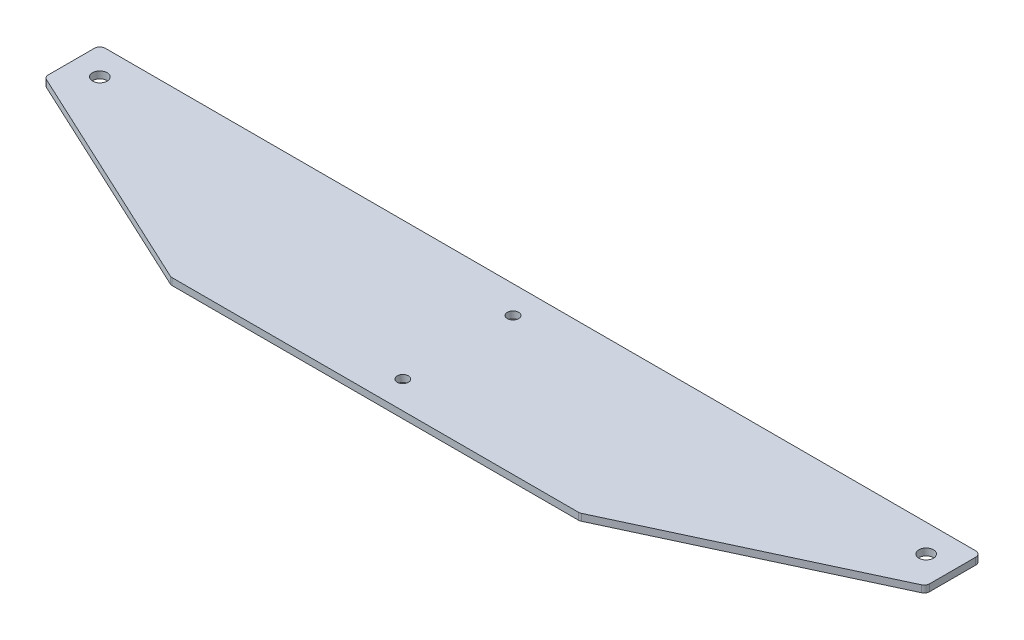
ISO-10303-21;
HEADER;
FILE_DESCRIPTION(('STEP AP214'),'2;1');
FILE_NAME('part.step','',(''),(''),'','','');
FILE_SCHEMA(('AUTOMOTIVE_DESIGN { 1 0 10303 214 1 1 1 1 }'));
ENDSEC;
DATA;
#1=APPLICATION_CONTEXT('core data for automotive mechanical design processes');
#2=APPLICATION_PROTOCOL_DEFINITION('international standard','automotive_design',2000,#1);
#3=PRODUCT_CONTEXT('',#1,'mechanical');
#4=PRODUCT('Part','Part','',(#3));
#5=PRODUCT_RELATED_PRODUCT_CATEGORY('part','',(#4));
#6=PRODUCT_DEFINITION_FORMATION('','',#4);
#7=PRODUCT_DEFINITION_CONTEXT('part definition',#1,'design');
#8=PRODUCT_DEFINITION('design','',#6,#7);
#9=PRODUCT_DEFINITION_SHAPE('','',#8);
#10=(LENGTH_UNIT() NAMED_UNIT(*) SI_UNIT(.MILLI.,.METRE.));
#11=(NAMED_UNIT(*) PLANE_ANGLE_UNIT() SI_UNIT($,.RADIAN.));
#12=(NAMED_UNIT(*) SI_UNIT($,.STERADIAN.) SOLID_ANGLE_UNIT());
#13=UNCERTAINTY_MEASURE_WITH_UNIT(LENGTH_MEASURE(1.E-05),#10,'distance_accuracy_value','');
#14=(GEOMETRIC_REPRESENTATION_CONTEXT(3) GLOBAL_UNCERTAINTY_ASSIGNED_CONTEXT((#13)) GLOBAL_UNIT_ASSIGNED_CONTEXT((#10,
#11,#12)) REPRESENTATION_CONTEXT('',''));
#15=CARTESIAN_POINT('',(0.,0.,0.));
#16=DIRECTION('',(0.,0.,1.));
#17=DIRECTION('',(1.,0.,0.));
#18=AXIS2_PLACEMENT_3D('',#15,#16,#17);
#19=CARTESIAN_POINT('',(0.,3.175,0.));
#20=DIRECTION('',(0.,-1.,0.));
#21=DIRECTION('',(0.,0.,-1.));
#22=AXIS2_PLACEMENT_3D('',#19,#20,#21);
#23=PLANE('',#22);
#24=DIRECTION('',(1.,0.,0.));
#25=VECTOR('',#24,1.);
#26=CARTESIAN_POINT('',(-203.2,3.175,38.1));
#27=LINE('',#26,#25);
#28=CARTESIAN_POINT('',(-93.6959439950015,3.175,38.1));
#29=VERTEX_POINT('',#28);
#30=CARTESIAN_POINT('',(93.6959439950015,3.175,38.1));
#31=VERTEX_POINT('',#30);
#32=EDGE_CURVE('E142',#29,#31,#27,.T.);
#33=ORIENTED_EDGE('',*,*,#32,.T.);
#34=CARTESIAN_POINT('',(93.6959439950015,3.175,35.56));
#35=DIRECTION('',(0.,-1.,0.));
#36=DIRECTION('',(0.,0.,-1.));
#37=AXIS2_PLACEMENT_3D('',#34,#35,#36);
#38=CIRCLE('',#37,2.54);
#39=CARTESIAN_POINT('',(94.7693943798229,3.175,37.8620217790731));
#40=VERTEX_POINT('',#39);
#41=EDGE_CURVE('E181',#31,#40,#38,.F.);
#42=ORIENTED_EDGE('',*,*,#41,.T.);
#43=DIRECTION('',(-0.90630778703665,0.,0.4226182617407));
#44=VECTOR('',#43,1.);
#45=CARTESIAN_POINT('',(203.2,3.175,-12.7));
#46=LINE('',#45,#44);
#47=CARTESIAN_POINT('',(201.733450384821,3.175,-12.016136683378));
#48=VERTEX_POINT('',#47);
#49=EDGE_CURVE('E144',#40,#48,#46,.F.);
#50=ORIENTED_EDGE('',*,*,#49,.T.);
#51=CARTESIAN_POINT('',(200.66,3.175,-14.3181584624511));
#52=DIRECTION('',(0.,-1.,0.));
#53=DIRECTION('',(0.,0.,-1.));
#54=AXIS2_PLACEMENT_3D('',#51,#52,#53);
#55=CIRCLE('',#54,2.54);
#56=CARTESIAN_POINT('',(203.2,3.175,-14.3181584624511));
#57=VERTEX_POINT('',#56);
#58=EDGE_CURVE('E175',#48,#57,#55,.F.);
#59=ORIENTED_EDGE('',*,*,#58,.T.);
#60=DIRECTION('',(0.,0.,-1.));
#61=VECTOR('',#60,1.);
#62=CARTESIAN_POINT('',(203.2,3.175,38.1));
#63=LINE('',#62,#61);
#64=CARTESIAN_POINT('',(203.2,3.175,-35.56));
#65=VERTEX_POINT('',#64);
#66=EDGE_CURVE('E150',#57,#65,#63,.T.);
#67=ORIENTED_EDGE('',*,*,#66,.T.);
#68=CARTESIAN_POINT('',(200.66,3.175,-35.56));
#69=DIRECTION('',(0.,-1.,0.));
#70=DIRECTION('',(0.,0.,-1.));
#71=AXIS2_PLACEMENT_3D('',#68,#69,#70);
#72=CIRCLE('',#71,2.54);
#73=CARTESIAN_POINT('',(200.66,3.175,-38.1));
#74=VERTEX_POINT('',#73);
#75=EDGE_CURVE('E173',#65,#74,#72,.F.);
#76=ORIENTED_EDGE('',*,*,#75,.T.);
#77=DIRECTION('',(-1.,0.,0.));
#78=VECTOR('',#77,1.);
#79=CARTESIAN_POINT('',(-203.2,3.175,-38.1));
#80=LINE('',#79,#78);
#81=CARTESIAN_POINT('',(-200.66,3.175,-38.1));
#82=VERTEX_POINT('',#81);
#83=EDGE_CURVE('E154',#74,#82,#80,.T.);
#84=ORIENTED_EDGE('',*,*,#83,.T.);
#85=CARTESIAN_POINT('',(-200.66,3.175,-35.56));
#86=DIRECTION('',(0.,-1.,0.));
#87=DIRECTION('',(0.,0.,-1.));
#88=AXIS2_PLACEMENT_3D('',#85,#86,#87);
#89=CIRCLE('',#88,2.54);
#90=CARTESIAN_POINT('',(-203.2,3.175,-35.56));
#91=VERTEX_POINT('',#90);
#92=EDGE_CURVE('E171',#82,#91,#89,.F.);
#93=ORIENTED_EDGE('',*,*,#92,.T.);
#94=DIRECTION('',(0.,0.,1.));
#95=VECTOR('',#94,1.);
#96=CARTESIAN_POINT('',(-203.2,3.175,38.1));
#97=LINE('',#96,#95);
#98=CARTESIAN_POINT('',(-203.2,3.175,-14.3181584624511));
#99=VERTEX_POINT('',#98);
#100=EDGE_CURVE('E218',#91,#99,#97,.T.);
#101=ORIENTED_EDGE('',*,*,#100,.T.);
#102=CARTESIAN_POINT('',(-200.66,3.175,-14.3181584624511));
#103=DIRECTION('',(0.,-1.,0.));
#104=DIRECTION('',(0.,0.,-1.));
#105=AXIS2_PLACEMENT_3D('',#102,#103,#104);
#106=CIRCLE('',#105,2.54);
#107=CARTESIAN_POINT('',(-201.733450384821,3.175,-12.016136683378));
#108=VERTEX_POINT('',#107);
#109=EDGE_CURVE('E177',#99,#108,#106,.F.);
#110=ORIENTED_EDGE('',*,*,#109,.T.);
#111=DIRECTION('',(-0.90630778703665,0.,-0.4226182617407));
#112=VECTOR('',#111,1.);
#113=CARTESIAN_POINT('',(-94.2590484381146,3.175,38.1));
#114=LINE('',#113,#112);
#115=CARTESIAN_POINT('',(-94.7693943798229,3.175,37.8620217790731));
#116=VERTEX_POINT('',#115);
#117=EDGE_CURVE('E163',#108,#116,#114,.F.);
#118=ORIENTED_EDGE('',*,*,#117,.T.);
#119=CARTESIAN_POINT('',(-93.6959439950015,3.175,35.56));
#120=DIRECTION('',(0.,-1.,0.));
#121=DIRECTION('',(0.,0.,-1.));
#122=AXIS2_PLACEMENT_3D('',#119,#120,#121);
#123=CIRCLE('',#122,2.54);
#124=EDGE_CURVE('E179',#116,#29,#123,.F.);
#125=ORIENTED_EDGE('',*,*,#124,.T.);
#126=EDGE_LOOP('',(#33,#42,#50,#59,#67,#76,#84,#93,#101,#110,#118,#125));
#127=FACE_BOUND('',#126,.T.);
#128=CARTESIAN_POINT('',(-190.5,3.175,-25.4));
#129=DIRECTION('',(0.,1.,0.));
#130=DIRECTION('',(0.,0.,1.));
#131=AXIS2_PLACEMENT_3D('',#128,#129,#130);
#132=CIRCLE('',#131,3.3734375);
#133=CARTESIAN_POINT('',(-190.5,3.175,-22.0265625));
#134=VERTEX_POINT('',#133);
#135=EDGE_CURVE('E234',#134,#134,#132,.T.);
#136=ORIENTED_EDGE('',*,*,#135,.F.);
#137=EDGE_LOOP('',(#136));
#138=FACE_BOUND('',#137,.T.);
#139=CARTESIAN_POINT('',(190.5,3.175,-25.4));
#140=DIRECTION('',(0.,1.,0.));
#141=DIRECTION('',(0.,0.,1.));
#142=AXIS2_PLACEMENT_3D('',#139,#140,#141);
#143=CIRCLE('',#142,3.3734375);
#144=CARTESIAN_POINT('',(190.5,3.175,-22.0265625));
#145=VERTEX_POINT('',#144);
#146=EDGE_CURVE('E243',#145,#145,#143,.T.);
#147=ORIENTED_EDGE('',*,*,#146,.F.);
#148=EDGE_LOOP('',(#147));
#149=FACE_BOUND('',#148,.T.);
#150=CARTESIAN_POINT('',(0.,3.175,-25.4));
#151=DIRECTION('',(0.,1.,0.));
#152=DIRECTION('',(0.,0.,1.));
#153=AXIS2_PLACEMENT_3D('',#150,#151,#152);
#154=CIRCLE('',#153,2.5796875);
#155=CARTESIAN_POINT('',(0.,3.175,-22.8203125));
#156=VERTEX_POINT('',#155);
#157=EDGE_CURVE('E249',#156,#156,#154,.T.);
#158=ORIENTED_EDGE('',*,*,#157,.F.);
#159=EDGE_LOOP('',(#158));
#160=FACE_BOUND('',#159,.T.);
#161=CARTESIAN_POINT('',(0.,3.175,25.4));
#162=DIRECTION('',(0.,1.,0.));
#163=DIRECTION('',(0.,0.,1.));
#164=AXIS2_PLACEMENT_3D('',#161,#162,#163);
#165=CIRCLE('',#164,2.5796875);
#166=CARTESIAN_POINT('',(0.,3.175,27.9796875));
#167=VERTEX_POINT('',#166);
#168=EDGE_CURVE('E255',#167,#167,#165,.T.);
#169=ORIENTED_EDGE('',*,*,#168,.F.);
#170=EDGE_LOOP('',(#169));
#171=FACE_BOUND('',#170,.T.);
#172=ADVANCED_FACE('F32',(#127,#138,#149,#160,#171),#23,.F.);
#173=CARTESIAN_POINT('',(0.,0.,0.));
#174=DIRECTION('',(0.,-1.,0.));
#175=DIRECTION('',(0.,0.,-1.));
#176=AXIS2_PLACEMENT_3D('',#173,#174,#175);
#177=PLANE('',#176);
#178=CARTESIAN_POINT('',(0.,0.,-25.4));
#179=DIRECTION('',(0.,1.,0.));
#180=DIRECTION('',(0.,0.,1.));
#181=AXIS2_PLACEMENT_3D('',#178,#179,#180);
#182=CIRCLE('',#181,2.5796875);
#183=CARTESIAN_POINT('',(0.,0.,-22.8203125));
#184=VERTEX_POINT('',#183);
#185=EDGE_CURVE('E252',#184,#184,#182,.T.);
#186=ORIENTED_EDGE('',*,*,#185,.T.);
#187=EDGE_LOOP('',(#186));
#188=FACE_BOUND('',#187,.T.);
#189=CARTESIAN_POINT('',(-190.5,0.,-25.4));
#190=DIRECTION('',(0.,1.,0.));
#191=DIRECTION('',(0.,0.,1.));
#192=AXIS2_PLACEMENT_3D('',#189,#190,#191);
#193=CIRCLE('',#192,3.3734375);
#194=CARTESIAN_POINT('',(-190.5,0.,-22.0265625));
#195=VERTEX_POINT('',#194);
#196=EDGE_CURVE('E238',#195,#195,#193,.T.);
#197=ORIENTED_EDGE('',*,*,#196,.T.);
#198=EDGE_LOOP('',(#197));
#199=FACE_BOUND('',#198,.T.);
#200=DIRECTION('',(0.90630778703665,0.,-0.4226182617407));
#201=VECTOR('',#200,1.);
#202=CARTESIAN_POINT('',(31.4283966420422,0.,67.3984140993788));
#203=LINE('',#202,#201);
#204=CARTESIAN_POINT('',(201.733450384821,0.,-12.016136683378));
#205=VERTEX_POINT('',#204);
#206=CARTESIAN_POINT('',(94.7693943798229,0.,37.8620217790731));
#207=VERTEX_POINT('',#206);
#208=EDGE_CURVE('E166',#205,#207,#203,.F.);
#209=ORIENTED_EDGE('',*,*,#208,.T.);
#210=CARTESIAN_POINT('',(93.6959439950015,0.,35.56));
#211=DIRECTION('',(0.,-1.,0.));
#212=DIRECTION('',(0.,0.,-1.));
#213=AXIS2_PLACEMENT_3D('',#210,#211,#212);
#214=CIRCLE('',#213,2.54);
#215=CARTESIAN_POINT('',(93.6959439950015,0.,38.1));
#216=VERTEX_POINT('',#215);
#217=EDGE_CURVE('E131',#207,#216,#214,.T.);
#218=ORIENTED_EDGE('',*,*,#217,.T.);
#219=DIRECTION('',(1.,0.,0.));
#220=VECTOR('',#219,1.);
#221=CARTESIAN_POINT('',(-203.2,0.,38.1));
#222=LINE('',#221,#220);
#223=CARTESIAN_POINT('',(-93.6959439950015,0.,38.1));
#224=VERTEX_POINT('',#223);
#225=EDGE_CURVE('E139',#224,#216,#222,.T.);
#226=ORIENTED_EDGE('',*,*,#225,.F.);
#227=CARTESIAN_POINT('',(-93.6959439950015,0.,35.56));
#228=DIRECTION('',(0.,-1.,0.));
#229=DIRECTION('',(0.,0.,-1.));
#230=AXIS2_PLACEMENT_3D('',#227,#228,#229);
#231=CIRCLE('',#230,2.54);
#232=CARTESIAN_POINT('',(-94.7693943798229,0.,37.8620217790731));
#233=VERTEX_POINT('',#232);
#234=EDGE_CURVE('E122',#224,#233,#231,.T.);
#235=ORIENTED_EDGE('',*,*,#234,.T.);
#236=DIRECTION('',(0.90630778703665,0.,0.4226182617407));
#237=VECTOR('',#236,1.);
#238=CARTESIAN_POINT('',(-31.4283966420422,0.,67.3984140993788));
#239=LINE('',#238,#237);
#240=CARTESIAN_POINT('',(-201.733450384821,0.,-12.016136683378));
#241=VERTEX_POINT('',#240);
#242=EDGE_CURVE('E161',#233,#241,#239,.F.);
#243=ORIENTED_EDGE('',*,*,#242,.T.);
#244=CARTESIAN_POINT('',(-200.66,0.,-14.3181584624511));
#245=DIRECTION('',(0.,-1.,0.));
#246=DIRECTION('',(0.,0.,-1.));
#247=AXIS2_PLACEMENT_3D('',#244,#245,#246);
#248=CIRCLE('',#247,2.54);
#249=CARTESIAN_POINT('',(-203.2,0.,-14.3181584624511));
#250=VERTEX_POINT('',#249);
#251=EDGE_CURVE('E132',#241,#250,#248,.T.);
#252=ORIENTED_EDGE('',*,*,#251,.T.);
#253=DIRECTION('',(0.,0.,1.));
#254=VECTOR('',#253,1.);
#255=CARTESIAN_POINT('',(-203.2,0.,38.1));
#256=LINE('',#255,#254);
#257=CARTESIAN_POINT('',(-203.2,0.,-35.56));
#258=VERTEX_POINT('',#257);
#259=EDGE_CURVE('E151',#258,#250,#256,.T.);
#260=ORIENTED_EDGE('',*,*,#259,.F.);
#261=CARTESIAN_POINT('',(-200.66,0.,-35.56));
#262=DIRECTION('',(0.,-1.,0.));
#263=DIRECTION('',(0.,0.,-1.));
#264=AXIS2_PLACEMENT_3D('',#261,#262,#263);
#265=CIRCLE('',#264,2.54);
#266=CARTESIAN_POINT('',(-200.66,0.,-38.1));
#267=VERTEX_POINT('',#266);
#268=EDGE_CURVE('E47',#258,#267,#265,.T.);
#269=ORIENTED_EDGE('',*,*,#268,.T.);
#270=DIRECTION('',(-1.,0.,0.));
#271=VECTOR('',#270,1.);
#272=CARTESIAN_POINT('',(-203.2,0.,-38.1));
#273=LINE('',#272,#271);
#274=CARTESIAN_POINT('',(200.66,0.,-38.1));
#275=VERTEX_POINT('',#274);
#276=EDGE_CURVE('E157',#275,#267,#273,.T.);
#277=ORIENTED_EDGE('',*,*,#276,.F.);
#278=CARTESIAN_POINT('',(200.66,0.,-35.56));
#279=DIRECTION('',(0.,-1.,0.));
#280=DIRECTION('',(0.,0.,-1.));
#281=AXIS2_PLACEMENT_3D('',#278,#279,#280);
#282=CIRCLE('',#281,2.54);
#283=CARTESIAN_POINT('',(203.2,0.,-35.56));
#284=VERTEX_POINT('',#283);
#285=EDGE_CURVE('E55',#275,#284,#282,.T.);
#286=ORIENTED_EDGE('',*,*,#285,.T.);
#287=DIRECTION('',(0.,0.,-1.));
#288=VECTOR('',#287,1.);
#289=CARTESIAN_POINT('',(203.2,0.,38.1));
#290=LINE('',#289,#288);
#291=CARTESIAN_POINT('',(203.2,0.,-14.3181584624511));
#292=VERTEX_POINT('',#291);
#293=EDGE_CURVE('E232',#292,#284,#290,.T.);
#294=ORIENTED_EDGE('',*,*,#293,.F.);
#295=CARTESIAN_POINT('',(200.66,0.,-14.3181584624511));
#296=DIRECTION('',(0.,-1.,0.));
#297=DIRECTION('',(0.,0.,-1.));
#298=AXIS2_PLACEMENT_3D('',#295,#296,#297);
#299=CIRCLE('',#298,2.54);
#300=EDGE_CURVE('E189',#292,#205,#299,.T.);
#301=ORIENTED_EDGE('',*,*,#300,.T.);
#302=EDGE_LOOP('',(#209,#218,#226,#235,#243,#252,#260,#269,#277,#286,#294,#301));
#303=FACE_BOUND('',#302,.T.);
#304=CARTESIAN_POINT('',(190.5,0.,-25.4));
#305=DIRECTION('',(0.,1.,0.));
#306=DIRECTION('',(0.,0.,1.));
#307=AXIS2_PLACEMENT_3D('',#304,#305,#306);
#308=CIRCLE('',#307,3.3734375);
#309=CARTESIAN_POINT('',(190.5,0.,-22.0265625));
#310=VERTEX_POINT('',#309);
#311=EDGE_CURVE('E246',#310,#310,#308,.T.);
#312=ORIENTED_EDGE('',*,*,#311,.T.);
#313=EDGE_LOOP('',(#312));
#314=FACE_BOUND('',#313,.T.);
#315=CARTESIAN_POINT('',(0.,0.,25.4));
#316=DIRECTION('',(0.,1.,0.));
#317=DIRECTION('',(0.,0.,1.));
#318=AXIS2_PLACEMENT_3D('',#315,#316,#317);
#319=CIRCLE('',#318,2.5796875);
#320=CARTESIAN_POINT('',(0.,0.,27.9796875));
#321=VERTEX_POINT('',#320);
#322=EDGE_CURVE('E258',#321,#321,#319,.T.);
#323=ORIENTED_EDGE('',*,*,#322,.T.);
#324=EDGE_LOOP('',(#323));
#325=FACE_BOUND('',#324,.T.);
#326=ADVANCED_FACE('F147',(#188,#199,#303,#314,#325),#177,.T.);
#327=CARTESIAN_POINT('',(203.2,3.175,38.1));
#328=DIRECTION('',(-1.,0.,0.));
#329=DIRECTION('',(0.,0.,1.));
#330=AXIS2_PLACEMENT_3D('',#327,#328,#329);
#331=PLANE('',#330);
#332=ORIENTED_EDGE('',*,*,#66,.F.);
#333=DIRECTION('',(0.,1.,0.));
#334=VECTOR('',#333,1.);
#335=CARTESIAN_POINT('',(203.2,0.,-14.3181584624511));
#336=LINE('',#335,#334);
#337=EDGE_CURVE('E204',#57,#292,#336,.F.);
#338=ORIENTED_EDGE('',*,*,#337,.T.);
#339=ORIENTED_EDGE('',*,*,#293,.T.);
#340=DIRECTION('',(0.,-1.,0.));
#341=VECTOR('',#340,1.);
#342=CARTESIAN_POINT('',(203.2,3.175,-35.56));
#343=LINE('',#342,#341);
#344=EDGE_CURVE('E202',#284,#65,#343,.F.);
#345=ORIENTED_EDGE('',*,*,#344,.T.);
#346=EDGE_LOOP('',(#332,#338,#339,#345));
#347=FACE_BOUND('',#346,.T.);
#348=ADVANCED_FACE('F272',(#347),#331,.F.);
#349=CARTESIAN_POINT('',(-203.2,3.175,-38.1));
#350=DIRECTION('',(0.,0.,1.));
#351=DIRECTION('',(1.,0.,0.));
#352=AXIS2_PLACEMENT_3D('',#349,#350,#351);
#353=PLANE('',#352);
#354=ORIENTED_EDGE('',*,*,#83,.F.);
#355=DIRECTION('',(0.,-1.,0.));
#356=VECTOR('',#355,1.);
#357=CARTESIAN_POINT('',(200.66,3.175,-38.1));
#358=LINE('',#357,#356);
#359=EDGE_CURVE('E11',#74,#275,#358,.T.);
#360=ORIENTED_EDGE('',*,*,#359,.T.);
#361=ORIENTED_EDGE('',*,*,#276,.T.);
#362=DIRECTION('',(0.,-1.,0.));
#363=VECTOR('',#362,1.);
#364=CARTESIAN_POINT('',(-200.66,3.175,-38.1));
#365=LINE('',#364,#363);
#366=EDGE_CURVE('E40',#267,#82,#365,.F.);
#367=ORIENTED_EDGE('',*,*,#366,.T.);
#368=EDGE_LOOP('',(#354,#360,#361,#367));
#369=FACE_BOUND('',#368,.T.);
#370=ADVANCED_FACE('F210',(#369),#353,.F.);
#371=CARTESIAN_POINT('',(-203.2,3.175,38.1));
#372=DIRECTION('',(1.,0.,0.));
#373=DIRECTION('',(0.,0.,-1.));
#374=AXIS2_PLACEMENT_3D('',#371,#372,#373);
#375=PLANE('',#374);
#376=ORIENTED_EDGE('',*,*,#259,.T.);
#377=DIRECTION('',(0.,-1.,0.));
#378=VECTOR('',#377,1.);
#379=CARTESIAN_POINT('',(-203.2,3.175,-14.3181584624511));
#380=LINE('',#379,#378);
#381=EDGE_CURVE('E199',#250,#99,#380,.F.);
#382=ORIENTED_EDGE('',*,*,#381,.T.);
#383=ORIENTED_EDGE('',*,*,#100,.F.);
#384=DIRECTION('',(0.,-1.,0.));
#385=VECTOR('',#384,1.);
#386=CARTESIAN_POINT('',(-203.2,3.175,-35.56));
#387=LINE('',#386,#385);
#388=EDGE_CURVE('E196',#91,#258,#387,.T.);
#389=ORIENTED_EDGE('',*,*,#388,.T.);
#390=EDGE_LOOP('',(#376,#382,#383,#389));
#391=FACE_BOUND('',#390,.T.);
#392=ADVANCED_FACE('F222',(#391),#375,.F.);
#393=CARTESIAN_POINT('',(-203.2,3.175,38.1));
#394=DIRECTION('',(0.,0.,-1.));
#395=DIRECTION('',(-1.,0.,0.));
#396=AXIS2_PLACEMENT_3D('',#393,#394,#395);
#397=PLANE('',#396);
#398=ORIENTED_EDGE('',*,*,#225,.T.);
#399=DIRECTION('',(0.,-1.,0.));
#400=VECTOR('',#399,1.);
#401=CARTESIAN_POINT('',(93.6959439950015,3.175,38.1));
#402=LINE('',#401,#400);
#403=EDGE_CURVE('E143',#216,#31,#402,.F.);
#404=ORIENTED_EDGE('',*,*,#403,.T.);
#405=ORIENTED_EDGE('',*,*,#32,.F.);
#406=DIRECTION('',(0.,1.,0.));
#407=VECTOR('',#406,1.);
#408=CARTESIAN_POINT('',(-93.6959439950015,0.,38.1));
#409=LINE('',#408,#407);
#410=EDGE_CURVE('E126',#29,#224,#409,.F.);
#411=ORIENTED_EDGE('',*,*,#410,.T.);
#412=EDGE_LOOP('',(#398,#404,#405,#411));
#413=FACE_BOUND('',#412,.T.);
#414=ADVANCED_FACE('F137',(#413),#397,.F.);
#415=CARTESIAN_POINT('',(-190.5,3.175,-25.4));
#416=DIRECTION('',(0.,-1.,0.));
#417=DIRECTION('',(0.,0.,-1.));
#418=AXIS2_PLACEMENT_3D('',#415,#416,#417);
#419=CYLINDRICAL_SURFACE('',#418,3.3734375);
#420=ORIENTED_EDGE('',*,*,#135,.T.);
#421=EDGE_LOOP('',(#420));
#422=FACE_BOUND('',#421,.T.);
#423=ORIENTED_EDGE('',*,*,#196,.F.);
#424=EDGE_LOOP('',(#423));
#425=FACE_BOUND('',#424,.T.);
#426=ADVANCED_FACE('F276',(#422,#425),#419,.F.);
#427=CARTESIAN_POINT('',(190.5,3.175,-25.4));
#428=DIRECTION('',(0.,-1.,0.));
#429=DIRECTION('',(0.,0.,-1.));
#430=AXIS2_PLACEMENT_3D('',#427,#428,#429);
#431=CYLINDRICAL_SURFACE('',#430,3.3734375);
#432=ORIENTED_EDGE('',*,*,#146,.T.);
#433=EDGE_LOOP('',(#432));
#434=FACE_BOUND('',#433,.T.);
#435=ORIENTED_EDGE('',*,*,#311,.F.);
#436=EDGE_LOOP('',(#435));
#437=FACE_BOUND('',#436,.T.);
#438=ADVANCED_FACE('F414',(#434,#437),#431,.F.);
#439=CARTESIAN_POINT('',(0.,3.175,-25.4));
#440=DIRECTION('',(0.,-1.,0.));
#441=DIRECTION('',(0.,0.,-1.));
#442=AXIS2_PLACEMENT_3D('',#439,#440,#441);
#443=CYLINDRICAL_SURFACE('',#442,2.5796875);
#444=ORIENTED_EDGE('',*,*,#157,.T.);
#445=EDGE_LOOP('',(#444));
#446=FACE_BOUND('',#445,.T.);
#447=ORIENTED_EDGE('',*,*,#185,.F.);
#448=EDGE_LOOP('',(#447));
#449=FACE_BOUND('',#448,.T.);
#450=ADVANCED_FACE('F405',(#446,#449),#443,.F.);
#451=CARTESIAN_POINT('',(0.,3.175,25.4));
#452=DIRECTION('',(0.,-1.,0.));
#453=DIRECTION('',(0.,0.,-1.));
#454=AXIS2_PLACEMENT_3D('',#451,#452,#453);
#455=CYLINDRICAL_SURFACE('',#454,2.5796875);
#456=ORIENTED_EDGE('',*,*,#168,.T.);
#457=EDGE_LOOP('',(#456));
#458=FACE_BOUND('',#457,.T.);
#459=ORIENTED_EDGE('',*,*,#322,.F.);
#460=EDGE_LOOP('',(#459));
#461=FACE_BOUND('',#460,.T.);
#462=ADVANCED_FACE('F264',(#458,#461),#455,.F.);
#463=CARTESIAN_POINT('',(-94.2590484381146,3.175,38.1));
#464=DIRECTION('',(0.4226182617407,0.,-0.90630778703665));
#465=DIRECTION('',(0.,-1.,0.));
#466=AXIS2_PLACEMENT_3D('',#463,#464,#465);
#467=PLANE('',#466);
#468=ORIENTED_EDGE('',*,*,#242,.F.);
#469=DIRECTION('',(0.,-1.,0.));
#470=VECTOR('',#469,1.);
#471=CARTESIAN_POINT('',(-94.7693943798229,3.175,37.8620217790731));
#472=LINE('',#471,#470);
#473=EDGE_CURVE('E127',#233,#116,#472,.F.);
#474=ORIENTED_EDGE('',*,*,#473,.T.);
#475=ORIENTED_EDGE('',*,*,#117,.F.);
#476=DIRECTION('',(0.,1.,0.));
#477=VECTOR('',#476,1.);
#478=CARTESIAN_POINT('',(-201.733450384821,0.,-12.016136683378));
#479=LINE('',#478,#477);
#480=EDGE_CURVE('E193',#108,#241,#479,.F.);
#481=ORIENTED_EDGE('',*,*,#480,.T.);
#482=EDGE_LOOP('',(#468,#474,#475,#481));
#483=FACE_BOUND('',#482,.T.);
#484=ADVANCED_FACE('F287',(#483),#467,.F.);
#485=CARTESIAN_POINT('',(203.2,3.175,-12.7));
#486=DIRECTION('',(-0.4226182617407,0.,-0.90630778703665));
#487=DIRECTION('',(0.,-1.,0.));
#488=AXIS2_PLACEMENT_3D('',#485,#486,#487);
#489=PLANE('',#488);
#490=ORIENTED_EDGE('',*,*,#49,.F.);
#491=DIRECTION('',(0.,1.,0.));
#492=VECTOR('',#491,1.);
#493=CARTESIAN_POINT('',(94.7693943798229,0.,37.8620217790731));
#494=LINE('',#493,#492);
#495=EDGE_CURVE('E185',#40,#207,#494,.F.);
#496=ORIENTED_EDGE('',*,*,#495,.T.);
#497=ORIENTED_EDGE('',*,*,#208,.F.);
#498=DIRECTION('',(0.,-1.,0.));
#499=VECTOR('',#498,1.);
#500=CARTESIAN_POINT('',(201.733450384821,3.175,-12.016136683378));
#501=LINE('',#500,#499);
#502=EDGE_CURVE('E183',#205,#48,#501,.F.);
#503=ORIENTED_EDGE('',*,*,#502,.T.);
#504=EDGE_LOOP('',(#490,#496,#497,#503));
#505=FACE_BOUND('',#504,.T.);
#506=ADVANCED_FACE('F290',(#505),#489,.F.);
#507=CARTESIAN_POINT('',(93.6959439950015,3.175,35.56));
#508=DIRECTION('',(0.,1.,0.));
#509=DIRECTION('',(0.,0.,1.));
#510=AXIS2_PLACEMENT_3D('',#507,#508,#509);
#511=CYLINDRICAL_SURFACE('',#510,2.54);
#512=ORIENTED_EDGE('',*,*,#217,.F.);
#513=ORIENTED_EDGE('',*,*,#495,.F.);
#514=ORIENTED_EDGE('',*,*,#41,.F.);
#515=ORIENTED_EDGE('',*,*,#403,.F.);
#516=EDGE_LOOP('',(#512,#513,#514,#515));
#517=FACE_BOUND('',#516,.T.);
#518=ADVANCED_FACE('F294',(#517),#511,.T.);
#519=CARTESIAN_POINT('',(-93.6959439950015,3.175,35.56));
#520=DIRECTION('',(0.,-1.,0.));
#521=DIRECTION('',(0.,0.,-1.));
#522=AXIS2_PLACEMENT_3D('',#519,#520,#521);
#523=CYLINDRICAL_SURFACE('',#522,2.54);
#524=ORIENTED_EDGE('',*,*,#124,.F.);
#525=ORIENTED_EDGE('',*,*,#473,.F.);
#526=ORIENTED_EDGE('',*,*,#234,.F.);
#527=ORIENTED_EDGE('',*,*,#410,.F.);
#528=EDGE_LOOP('',(#524,#525,#526,#527));
#529=FACE_BOUND('',#528,.T.);
#530=ADVANCED_FACE('F125',(#529),#523,.T.);
#531=CARTESIAN_POINT('',(-200.66,3.175,-14.3181584624511));
#532=DIRECTION('',(0.,1.,0.));
#533=DIRECTION('',(0.,0.,1.));
#534=AXIS2_PLACEMENT_3D('',#531,#532,#533);
#535=CYLINDRICAL_SURFACE('',#534,2.54);
#536=ORIENTED_EDGE('',*,*,#251,.F.);
#537=ORIENTED_EDGE('',*,*,#480,.F.);
#538=ORIENTED_EDGE('',*,*,#109,.F.);
#539=ORIENTED_EDGE('',*,*,#381,.F.);
#540=EDGE_LOOP('',(#536,#537,#538,#539));
#541=FACE_BOUND('',#540,.T.);
#542=ADVANCED_FACE('F227',(#541),#535,.T.);
#543=CARTESIAN_POINT('',(200.66,3.175,-14.3181584624511));
#544=DIRECTION('',(0.,-1.,0.));
#545=DIRECTION('',(0.,0.,-1.));
#546=AXIS2_PLACEMENT_3D('',#543,#544,#545);
#547=CYLINDRICAL_SURFACE('',#546,2.54);
#548=ORIENTED_EDGE('',*,*,#58,.F.);
#549=ORIENTED_EDGE('',*,*,#502,.F.);
#550=ORIENTED_EDGE('',*,*,#300,.F.);
#551=ORIENTED_EDGE('',*,*,#337,.F.);
#552=EDGE_LOOP('',(#548,#549,#550,#551));
#553=FACE_BOUND('',#552,.T.);
#554=ADVANCED_FACE('F303',(#553),#547,.T.);
#555=CARTESIAN_POINT('',(200.66,3.175,-35.56));
#556=DIRECTION('',(0.,-1.,0.));
#557=DIRECTION('',(0.,0.,-1.));
#558=AXIS2_PLACEMENT_3D('',#555,#556,#557);
#559=CYLINDRICAL_SURFACE('',#558,2.54);
#560=ORIENTED_EDGE('',*,*,#75,.F.);
#561=ORIENTED_EDGE('',*,*,#344,.F.);
#562=ORIENTED_EDGE('',*,*,#285,.F.);
#563=ORIENTED_EDGE('',*,*,#359,.F.);
#564=EDGE_LOOP('',(#560,#561,#562,#563));
#565=FACE_BOUND('',#564,.T.);
#566=ADVANCED_FACE('F305',(#565),#559,.T.);
#567=CARTESIAN_POINT('',(-200.66,3.175,-35.56));
#568=DIRECTION('',(0.,-1.,0.));
#569=DIRECTION('',(0.,0.,-1.));
#570=AXIS2_PLACEMENT_3D('',#567,#568,#569);
#571=CYLINDRICAL_SURFACE('',#570,2.54);
#572=ORIENTED_EDGE('',*,*,#92,.F.);
#573=ORIENTED_EDGE('',*,*,#366,.F.);
#574=ORIENTED_EDGE('',*,*,#268,.F.);
#575=ORIENTED_EDGE('',*,*,#388,.F.);
#576=EDGE_LOOP('',(#572,#573,#574,#575));
#577=FACE_BOUND('',#576,.T.);
#578=ADVANCED_FACE('F34',(#577),#571,.T.);
#579=CLOSED_SHELL('',(#172,#326,#348,#370,#392,#414,#426,#438,#450,#462,#484,#506,#518,#530,
#542,#554,#566,#578));
#580=MANIFOLD_SOLID_BREP('B2',#579);
#581=ADVANCED_BREP_SHAPE_REPRESENTATION('',(#18,#580),#14);
#582=SHAPE_DEFINITION_REPRESENTATION(#9,#581);
ENDSEC;
END-ISO-10303-21;
